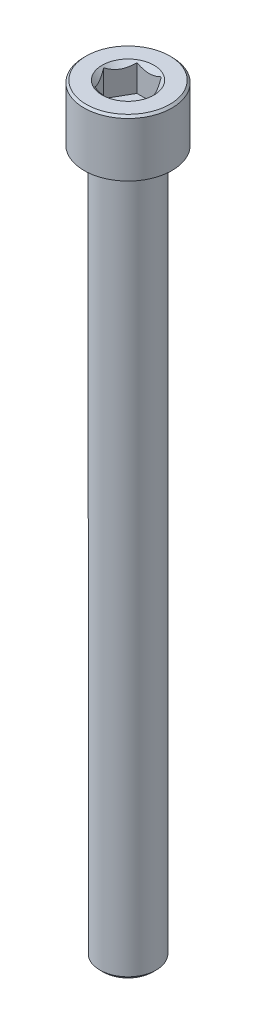
ISO-10303-21;
HEADER;
FILE_DESCRIPTION(('STEP AP214'),'2;1');
FILE_NAME('part.step','',(''),(''),'','','');
FILE_SCHEMA(('AUTOMOTIVE_DESIGN { 1 0 10303 214 1 1 1 1 }'));
ENDSEC;
DATA;
#1=APPLICATION_CONTEXT('core data for automotive mechanical design processes');
#2=APPLICATION_PROTOCOL_DEFINITION('international standard','automotive_design',2000,#1);
#3=PRODUCT_CONTEXT('',#1,'mechanical');
#4=PRODUCT('Part','Part','',(#3));
#5=PRODUCT_RELATED_PRODUCT_CATEGORY('part','',(#4));
#6=PRODUCT_DEFINITION_FORMATION('','',#4);
#7=PRODUCT_DEFINITION_CONTEXT('part definition',#1,'design');
#8=PRODUCT_DEFINITION('design','',#6,#7);
#9=PRODUCT_DEFINITION_SHAPE('','',#8);
#10=(LENGTH_UNIT() NAMED_UNIT(*) SI_UNIT(.MILLI.,.METRE.));
#11=(NAMED_UNIT(*) PLANE_ANGLE_UNIT() SI_UNIT($,.RADIAN.));
#12=(NAMED_UNIT(*) SI_UNIT($,.STERADIAN.) SOLID_ANGLE_UNIT());
#13=UNCERTAINTY_MEASURE_WITH_UNIT(LENGTH_MEASURE(1.E-05),#10,'distance_accuracy_value','');
#14=(GEOMETRIC_REPRESENTATION_CONTEXT(3) GLOBAL_UNCERTAINTY_ASSIGNED_CONTEXT((#13)) GLOBAL_UNIT_ASSIGNED_CONTEXT((#10,
#11,#12)) REPRESENTATION_CONTEXT('',''));
#15=CARTESIAN_POINT('',(0.,0.,0.));
#16=DIRECTION('',(0.,0.,1.));
#17=DIRECTION('',(1.,0.,0.));
#18=AXIS2_PLACEMENT_3D('',#15,#16,#17);
#19=CARTESIAN_POINT('',(0.,0.,0.));
#20=DIRECTION('',(0.,1.,0.));
#21=DIRECTION('',(0.,0.,1.));
#22=AXIS2_PLACEMENT_3D('',#19,#20,#21);
#23=PLANE('',#22);
#24=CARTESIAN_POINT('',(0.,0.,0.));
#25=DIRECTION('',(0.,1.,0.));
#26=DIRECTION('',(0.,0.,1.));
#27=AXIS2_PLACEMENT_3D('',#24,#25,#26);
#28=CIRCLE('',#27,3.50000000000002);
#29=CARTESIAN_POINT('',(0.,0.,3.50000000000002));
#30=VERTEX_POINT('',#29);
#31=EDGE_CURVE('E42',#30,#30,#28,.F.);
#32=ORIENTED_EDGE('',*,*,#31,.T.);
#33=EDGE_LOOP('',(#32));
#34=FACE_BOUND('',#33,.T.);
#35=ADVANCED_FACE('F34',(#34),#23,.F.);
#36=CARTESIAN_POINT('',(0.,0.,0.));
#37=DIRECTION('',(0.,-1.,0.));
#38=DIRECTION('',(0.,0.,-1.));
#39=AXIS2_PLACEMENT_3D('',#36,#37,#38);
#40=CYLINDRICAL_SURFACE('',#39,4.);
#41=CARTESIAN_POINT('',(0.,0.499999999999997,0.));
#42=DIRECTION('',(0.,1.,0.));
#43=DIRECTION('',(0.,0.,1.));
#44=AXIS2_PLACEMENT_3D('',#41,#42,#43);
#45=CIRCLE('',#44,4.);
#46=CARTESIAN_POINT('',(0.,0.499999999999997,4.));
#47=VERTEX_POINT('',#46);
#48=EDGE_CURVE('E11',#47,#47,#45,.T.);
#49=ORIENTED_EDGE('',*,*,#48,.T.);
#50=EDGE_LOOP('',(#49));
#51=FACE_BOUND('',#50,.T.);
#52=CARTESIAN_POINT('',(0.,100.,0.));
#53=DIRECTION('',(0.,-1.,0.));
#54=DIRECTION('',(0.,0.,-1.));
#55=AXIS2_PLACEMENT_3D('',#52,#53,#54);
#56=CIRCLE('',#55,4.);
#57=CARTESIAN_POINT('',(0.,100.,-4.));
#58=VERTEX_POINT('',#57);
#59=EDGE_CURVE('E119',#58,#58,#56,.T.);
#60=ORIENTED_EDGE('',*,*,#59,.T.);
#61=EDGE_LOOP('',(#60));
#62=FACE_BOUND('',#61,.T.);
#63=ADVANCED_FACE('F190',(#51,#62),#40,.T.);
#64=CARTESIAN_POINT('',(-4.,100.,0.));
#65=DIRECTION('',(0.,1.,0.));
#66=DIRECTION('',(0.,0.,1.));
#67=AXIS2_PLACEMENT_3D('',#64,#65,#66);
#68=PLANE('',#67);
#69=ORIENTED_EDGE('',*,*,#59,.F.);
#70=EDGE_LOOP('',(#69));
#71=FACE_BOUND('',#70,.T.);
#72=CARTESIAN_POINT('',(0.,100.,0.));
#73=DIRECTION('',(0.,-1.,0.));
#74=DIRECTION('',(0.,0.,-1.));
#75=AXIS2_PLACEMENT_3D('',#72,#73,#74);
#76=CIRCLE('',#75,6.25);
#77=CARTESIAN_POINT('',(0.,100.,-6.25));
#78=VERTEX_POINT('',#77);
#79=EDGE_CURVE('E116',#78,#78,#76,.T.);
#80=ORIENTED_EDGE('',*,*,#79,.T.);
#81=EDGE_LOOP('',(#80));
#82=FACE_BOUND('',#81,.T.);
#83=ADVANCED_FACE('F196',(#71,#82),#68,.F.);
#84=CARTESIAN_POINT('',(0.,0.,0.));
#85=DIRECTION('',(0.,-1.,0.));
#86=DIRECTION('',(0.,0.,-1.));
#87=AXIS2_PLACEMENT_3D('',#84,#85,#86);
#88=CYLINDRICAL_SURFACE('',#87,6.25);
#89=CARTESIAN_POINT('',(0.,107.7,0.));
#90=DIRECTION('',(0.,-1.,0.));
#91=DIRECTION('',(0.,0.,-1.));
#92=AXIS2_PLACEMENT_3D('',#89,#90,#91);
#93=CIRCLE('',#92,6.25);
#94=CARTESIAN_POINT('',(0.,107.7,-6.25));
#95=VERTEX_POINT('',#94);
#96=EDGE_CURVE('E122',#95,#95,#93,.T.);
#97=ORIENTED_EDGE('',*,*,#96,.T.);
#98=EDGE_LOOP('',(#97));
#99=FACE_BOUND('',#98,.T.);
#100=ORIENTED_EDGE('',*,*,#79,.F.);
#101=EDGE_LOOP('',(#100));
#102=FACE_BOUND('',#101,.T.);
#103=ADVANCED_FACE('F207',(#99,#102),#88,.T.);
#104=CARTESIAN_POINT('',(-6.25,108.,0.));
#105=DIRECTION('',(0.,-1.,0.));
#106=DIRECTION('',(0.,0.,-1.));
#107=AXIS2_PLACEMENT_3D('',#104,#105,#106);
#108=PLANE('',#107);
#109=CARTESIAN_POINT('',(0.,108.,0.));
#110=DIRECTION('',(0.,1.,0.));
#111=DIRECTION('',(0.,0.,1.));
#112=AXIS2_PLACEMENT_3D('',#109,#110,#111);
#113=CIRCLE('',#112,3.68172134015619);
#114=CARTESIAN_POINT('',(0.,108.,3.68172134015619));
#115=VERTEX_POINT('',#114);
#116=EDGE_CURVE('E337',#115,#115,#113,.T.);
#117=ORIENTED_EDGE('',*,*,#116,.F.);
#118=EDGE_LOOP('',(#117));
#119=FACE_BOUND('',#118,.T.);
#120=CARTESIAN_POINT('',(0.,108.,0.));
#121=DIRECTION('',(0.,-1.,0.));
#122=DIRECTION('',(0.,0.,-1.));
#123=AXIS2_PLACEMENT_3D('',#120,#121,#122);
#124=CIRCLE('',#123,5.95);
#125=CARTESIAN_POINT('',(0.,108.,-5.95));
#126=VERTEX_POINT('',#125);
#127=EDGE_CURVE('E93',#126,#126,#124,.F.);
#128=ORIENTED_EDGE('',*,*,#127,.T.);
#129=EDGE_LOOP('',(#128));
#130=FACE_BOUND('',#129,.T.);
#131=ADVANCED_FACE('F202',(#119,#130),#108,.F.);
#132=CARTESIAN_POINT('',(0.,107.7,0.));
#133=DIRECTION('',(0.,-1.,0.));
#134=DIRECTION('',(0.,0.,-1.));
#135=AXIS2_PLACEMENT_3D('',#132,#133,#134);
#136=CONICAL_SURFACE('',#135,6.25,0.78539816339744);
#137=ORIENTED_EDGE('',*,*,#127,.F.);
#138=EDGE_LOOP('',(#137));
#139=FACE_BOUND('',#138,.T.);
#140=ORIENTED_EDGE('',*,*,#96,.F.);
#141=EDGE_LOOP('',(#140));
#142=FACE_BOUND('',#141,.T.);
#143=ADVANCED_FACE('F138',(#139,#142),#136,.T.);
#144=CARTESIAN_POINT('',(0.,108.,0.));
#145=DIRECTION('',(0.,1.,0.));
#146=DIRECTION('',(0.,0.,1.));
#147=AXIS2_PLACEMENT_3D('',#144,#145,#146);
#148=CONICAL_SURFACE('',#147,3.68172134015619,0.785398163397449);
#149=ORIENTED_EDGE('',*,*,#116,.T.);
#150=EDGE_LOOP('',(#149));
#151=FACE_BOUND('',#150,.T.);
#152=CARTESIAN_POINT('',(-3.57414153717217,108.984592807835,3.));
#153=CARTESIAN_POINT('',(-3.48763354421077,108.918347344031,3.));
#154=CARTESIAN_POINT('',(-3.40065485701271,108.852706801405,3.));
#155=CARTESIAN_POINT('',(-3.22556536628367,108.722910559625,3.));
#156=CARTESIAN_POINT('',(-3.13745429592208,108.658755220799,3.));
#157=CARTESIAN_POINT('',(-2.95926502940819,108.531747762569,3.));
#158=CARTESIAN_POINT('',(-2.86917689491204,108.468909540486,3.));
#159=CARTESIAN_POINT('',(-2.68749351951163,108.345458372127,3.));
#160=CARTESIAN_POINT('',(-2.5958983836401,108.284845271712,3.));
#161=CARTESIAN_POINT('',(-2.40523426187287,108.162685615211,3.));
#162=CARTESIAN_POINT('',(-2.30605328102177,108.101312978607,3.));
#163=CARTESIAN_POINT('',(-2.105365061048,107.982432521032,3.));
#164=CARTESIAN_POINT('',(-2.00385743987677,107.924925340978,3.));
#165=CARTESIAN_POINT('',(-1.79849745550954,107.815004606373,3.));
#166=CARTESIAN_POINT('',(-1.69465316441121,107.762576089066,3.));
#167=CARTESIAN_POINT('',(-1.48405420683512,107.663987161909,3.));
#168=CARTESIAN_POINT('',(-1.37730092797841,107.617823824235,3.));
#169=CARTESIAN_POINT('',(-1.17088222190216,107.53741031137,3.));
#170=CARTESIAN_POINT('',(-1.07149734601239,107.502447322176,3.));
#171=CARTESIAN_POINT('',(-0.870230144552076,107.440480240414,3.));
#172=CARTESIAN_POINT('',(-0.768347657354247,107.4134766644,3.));
#173=CARTESIAN_POINT('',(-0.564447624779061,107.36932660234,3.));
#174=CARTESIAN_POINT('',(-0.462468933304163,107.352003667627,3.));
#175=CARTESIAN_POINT('',(-0.257288650084501,107.327570363368,3.));
#176=CARTESIAN_POINT('',(-0.154087304614485,107.320457971263,3.));
#177=CARTESIAN_POINT('',(0.0481861337271449,107.31703234318,3.));
#178=CARTESIAN_POINT('',(0.147250905244539,107.320281023826,3.));
#179=CARTESIAN_POINT('',(0.344589076655326,107.336401424681,3.));
#180=CARTESIAN_POINT('',(0.44286240247697,107.349274035257,3.));
#181=CARTESIAN_POINT('',(0.639570667541517,107.384139691062,3.));
#182=CARTESIAN_POINT('',(0.737976852204942,107.406292278974,3.));
#183=CARTESIAN_POINT('',(0.932628435913937,107.458500908432,3.));
#184=CARTESIAN_POINT('',(1.02887397223985,107.4885564463,3.));
#185=CARTESIAN_POINT('',(1.22532003458177,107.557474722556,3.));
#186=CARTESIAN_POINT('',(1.32536043310458,107.596788867538,3.));
#187=CARTESIAN_POINT('',(1.5228495241282,107.681477566289,3.));
#188=CARTESIAN_POINT('',(1.62029736425405,107.726854084409,3.));
#189=CARTESIAN_POINT('',(1.81308604298931,107.82259854372,3.));
#190=CARTESIAN_POINT('',(1.90841896877327,107.872982289026,3.));
#191=CARTESIAN_POINT('',(2.09689622819787,107.977627277898,3.));
#192=CARTESIAN_POINT('',(2.19004094502824,108.031887835746,3.));
#193=CARTESIAN_POINT('',(2.369872611791,108.140769155629,3.));
#194=CARTESIAN_POINT('',(2.45665114613526,108.195239452964,3.));
#195=CARTESIAN_POINT('',(2.62871750489488,108.306492646486,3.));
#196=CARTESIAN_POINT('',(2.71400521657293,108.363275716495,3.));
#197=CARTESIAN_POINT('',(2.88259790064296,108.47827802722,3.));
#198=CARTESIAN_POINT('',(2.96591330750259,108.536482026023,3.));
#199=CARTESIAN_POINT('',(3.13140205426232,108.654445790406,3.));
#200=CARTESIAN_POINT('',(3.21357570254097,108.714205122864,3.));
#201=CARTESIAN_POINT('',(3.2952705817368,108.77460093352,3.));
#202=B_SPLINE_CURVE_WITH_KNOTS('',3,(#152,#153,#154,#155,#156,#157,#158,#159,#160,#161,#162,
#163,#164,#165,#166,#167,#168,#169,#170,#171,#172,#173,#174,#175,#176,#177,#178,#179,#180,#181,
#182,#183,#184,#185,#186,#187,#188,#189,#190,#191,#192,#193,#194,#195,#196,#197,#198,#199,#200,
#201),.UNSPECIFIED.,.F.,.F.,(4,2,2,2,2,2,2,2,2,2,2,2,2,2,2,2,2,2,2,2,2,2,2,2,4),(0.,
0.326883534696343,0.653845561216819,0.983333574679485,1.31279872045119,1.66263039077582,
2.012519923068,2.36134508374108,2.71000666706381,3.02579926641578,3.34161235580212,
3.65146388205708,3.96125402275307,4.25812208285705,4.55501761141501,4.85724167639796,
5.15944648441816,5.48166266665303,5.80398350895796,6.12735610013868,6.45067163510515,
6.7580009601291,7.0653534259893,7.37023156667128,7.67502569597),.UNSPECIFIED.);
#203=CARTESIAN_POINT('',(-1.73205080756888,107.782380274982,3.));
#204=VERTEX_POINT('',#203);
#205=CARTESIAN_POINT('',(1.73205080756888,107.782380274982,3.));
#206=VERTEX_POINT('',#205);
#207=EDGE_CURVE('E100',#204,#206,#202,.T.);
#208=ORIENTED_EDGE('',*,*,#207,.F.);
#209=CARTESIAN_POINT('',(-3.46421708519159,107.782495750809,-0.000199999999999535));
#210=CARTESIAN_POINT('',(-3.40467869607211,107.723008593303,0.102923514955744));
#211=CARTESIAN_POINT('',(-3.34414474757781,107.667015254447,0.207771389330644));
#212=CARTESIAN_POINT('',(-3.2207094063533,107.564492871361,0.421567671781089));
#213=CARTESIAN_POINT('',(-3.15779627521276,107.518020868723,0.530536411379754));
#214=CARTESIAN_POINT('',(-3.03093496880242,107.438413463498,0.750266639597022));
#215=CARTESIAN_POINT('',(-2.96701910000607,107.405077975624,0.860972171762204));
#216=CARTESIAN_POINT('',(-2.83778025907547,107.353717818961,1.08482041056532));
#217=CARTESIAN_POINT('',(-2.7724612348602,107.335654812517,1.19795627920698));
#218=CARTESIAN_POINT('',(-2.65988677911465,107.319357183432,1.39294095619269));
#219=CARTESIAN_POINT('',(-2.61277673046431,107.316944642155,1.47453795400212));
#220=CARTESIAN_POINT('',(-2.51863325954798,107.321009709639,1.63759922883008));
#221=CARTESIAN_POINT('',(-2.47159986993094,107.32749043501,1.71906344929898));
#222=CARTESIAN_POINT('',(-2.37797867687426,107.348971997497,1.88122011233836));
#223=CARTESIAN_POINT('',(-2.3313914312269,107.363982364949,1.96191158878429));
#224=CARTESIAN_POINT('',(-2.23901705721439,107.401703921048,2.12190869789132));
#225=CARTESIAN_POINT('',(-2.1932298677905,107.424414519304,2.20121443630928));
#226=CARTESIAN_POINT('',(-2.11194373930154,107.471140959836,2.34200614080274));
#227=CARTESIAN_POINT('',(-2.07626488907773,107.493928602662,2.40380372214601));
#228=CARTESIAN_POINT('',(-2.00554773988156,107.543176561039,2.52628941752021));
#229=CARTESIAN_POINT('',(-1.97050946049034,107.569636988648,2.58697749763559));
#230=CARTESIAN_POINT('',(-1.90118383838356,107.625637269373,2.70705299739086));
#231=CARTESIAN_POINT('',(-1.86689452386373,107.65516743946,2.76644383229591));
#232=CARTESIAN_POINT('',(-1.79895094584795,107.716919366557,2.88412556146727));
#233=CARTESIAN_POINT('',(-1.76529630793217,107.749139471641,2.94241710424773));
#234=CARTESIAN_POINT('',(-1.73193533751504,107.782495750809,3.0002));
#235=B_SPLINE_CURVE_WITH_KNOTS('',3,(#209,#210,#211,#212,#213,#214,#215,#216,#217,#218,#219,
#220,#221,#222,#223,#224,#225,#226,#227,#228,#229,#230,#231,#232,#233,#234),.UNSPECIFIED.,.F.,
.F.,(4,2,2,2,2,2,2,2,2,2,2,2,4),(0.,0.399603557139297,0.801535286397833,1.19708369162342,
1.59163620080172,1.87398941755843,2.15644160919091,2.43921001247424,2.72195674032136,
2.94657516661925,3.17120044767274,3.39513752837809,3.61893808380739),.UNSPECIFIED.);
#236=CARTESIAN_POINT('',(-3.46410161513775,107.782380274982,0.));
#237=VERTEX_POINT('',#236);
#238=EDGE_CURVE('E158',#237,#204,#235,.T.);
#239=ORIENTED_EDGE('',*,*,#238,.F.);
#240=CARTESIAN_POINT('',(-1.73193533751504,107.782495750809,-3.0002));
#241=CARTESIAN_POINT('',(-1.79147372663452,107.723008593303,-2.89707648504425));
#242=CARTESIAN_POINT('',(-1.85200767512883,107.667015254447,-2.79222861066935));
#243=CARTESIAN_POINT('',(-1.97544301635334,107.564492871361,-2.5784323282189));
#244=CARTESIAN_POINT('',(-2.03835614749388,107.518020868723,-2.46946358862024));
#245=CARTESIAN_POINT('',(-2.16521745390422,107.438413463498,-2.24973336040297));
#246=CARTESIAN_POINT('',(-2.22913332270057,107.405077975624,-2.13902782823779));
#247=CARTESIAN_POINT('',(-2.35837216363117,107.353717818961,-1.91517958943468));
#248=CARTESIAN_POINT('',(-2.42369118784644,107.335654812517,-1.80204372079301));
#249=CARTESIAN_POINT('',(-2.53626564359199,107.319357183432,-1.6070590438073));
#250=CARTESIAN_POINT('',(-2.58337569224233,107.316944642155,-1.52546204599787));
#251=CARTESIAN_POINT('',(-2.67751916315865,107.321009709639,-1.36240077116991));
#252=CARTESIAN_POINT('',(-2.72455255277569,107.32749043501,-1.28093655070102));
#253=CARTESIAN_POINT('',(-2.81817374583237,107.348971997497,-1.11877988766163));
#254=CARTESIAN_POINT('',(-2.86476099147974,107.363982364949,-1.0380884112157));
#255=CARTESIAN_POINT('',(-2.95713536549225,107.401703921048,-0.87809130210867));
#256=CARTESIAN_POINT('',(-3.00292255491614,107.424414519304,-0.798785563690709));
#257=CARTESIAN_POINT('',(-3.0842086834051,107.471140959836,-0.657993859197251));
#258=CARTESIAN_POINT('',(-3.11988753362891,107.493928602662,-0.596196277853977));
#259=CARTESIAN_POINT('',(-3.19060468282508,107.543176561039,-0.473710582479782));
#260=CARTESIAN_POINT('',(-3.2256429622163,107.569636988648,-0.413022502364399));
#261=CARTESIAN_POINT('',(-3.29496858432307,107.625637269373,-0.29294700260914));
#262=CARTESIAN_POINT('',(-3.32925789884291,107.65516743946,-0.233556167704084));
#263=CARTESIAN_POINT('',(-3.39720147685869,107.716919366557,-0.115874438532732));
#264=CARTESIAN_POINT('',(-3.43085611477447,107.749139471641,-0.0575828957522648));
#265=CARTESIAN_POINT('',(-3.46421708519159,107.782495750809,0.000199999999999888));
#266=B_SPLINE_CURVE_WITH_KNOTS('',3,(#240,#241,#242,#243,#244,#245,#246,#247,#248,#249,#250,
#251,#252,#253,#254,#255,#256,#257,#258,#259,#260,#261,#262,#263,#264,#265),.UNSPECIFIED.,.F.,
.F.,(4,2,2,2,2,2,2,2,2,2,2,2,4),(0.,0.399603557139306,0.801535286397845,1.19708369162343,
1.59163620080172,1.87398941755844,2.15644160919092,2.43921001247424,2.72195674032137,
2.94657516661926,3.17120044767274,3.39513752837809,3.61893808380739),.UNSPECIFIED.);
#267=CARTESIAN_POINT('',(-1.73205080756888,107.782380274982,-3.));
#268=VERTEX_POINT('',#267);
#269=EDGE_CURVE('E152',#268,#237,#266,.T.);
#270=ORIENTED_EDGE('',*,*,#269,.F.);
#271=CARTESIAN_POINT('',(-3.57414153716177,108.984592807827,-3.));
#272=CARTESIAN_POINT('',(-3.48763354420066,108.918347344023,-3.));
#273=CARTESIAN_POINT('',(-3.4006548570029,108.852706801397,-3.));
#274=CARTESIAN_POINT('',(-3.22556536627446,108.722910559618,-3.));
#275=CARTESIAN_POINT('',(-3.13745429591317,108.658755220793,-3.));
#276=CARTESIAN_POINT('',(-2.95926502939989,108.531747762563,-3.));
#277=CARTESIAN_POINT('',(-2.86917689490405,108.46890954048,-3.));
#278=CARTESIAN_POINT('',(-2.68749351950427,108.345458372122,-3.));
#279=CARTESIAN_POINT('',(-2.59589838363306,108.284845271707,-3.));
#280=CARTESIAN_POINT('',(-2.40523426186653,108.162685615207,-3.));
#281=CARTESIAN_POINT('',(-2.3060532810158,108.101312978603,-3.));
#282=CARTESIAN_POINT('',(-2.10536506104279,107.982432521029,-3.));
#283=CARTESIAN_POINT('',(-2.00385743987194,107.924925340976,-3.));
#284=CARTESIAN_POINT('',(-1.79849745550547,107.815004606371,-3.));
#285=CARTESIAN_POINT('',(-1.69465316440754,107.762576089064,-3.));
#286=CARTESIAN_POINT('',(-1.48405420683225,107.663987161908,-3.));
#287=CARTESIAN_POINT('',(-1.37730092797596,107.617823824234,-3.));
#288=CARTESIAN_POINT('',(-1.17088222189989,107.537410311369,-3.));
#289=CARTESIAN_POINT('',(-1.07149734600986,107.502447322176,-3.));
#290=CARTESIAN_POINT('',(-0.870230144549019,107.440480240413,-3.));
#291=CARTESIAN_POINT('',(-0.768347657350922,107.413476664399,-3.));
#292=CARTESIAN_POINT('',(-0.564447624775211,107.36932660234,-3.));
#293=CARTESIAN_POINT('',(-0.462468933300055,107.352003667626,-3.));
#294=CARTESIAN_POINT('',(-0.257288650079884,107.327570363368,-3.));
#295=CARTESIAN_POINT('',(-0.154087304609616,107.320457971262,-3.));
#296=CARTESIAN_POINT('',(0.0481861337324526,107.317032343181,-3.));
#297=CARTESIAN_POINT('',(0.147250905250035,107.320281023826,-3.));
#298=CARTESIAN_POINT('',(0.344589076661178,107.336401424681,-3.));
#299=CARTESIAN_POINT('',(0.442862402482988,107.349274035258,-3.));
#300=CARTESIAN_POINT('',(0.639570667547867,107.384139691064,-3.));
#301=CARTESIAN_POINT('',(0.737976852211455,107.406292278976,-3.));
#302=CARTESIAN_POINT('',(0.932628435920758,107.458500908434,-3.));
#303=CARTESIAN_POINT('',(1.02887397224682,107.488556446302,-3.));
#304=CARTESIAN_POINT('',(1.22532003458955,107.557474722558,-3.));
#305=CARTESIAN_POINT('',(1.32536043311302,107.596788867542,-3.));
#306=CARTESIAN_POINT('',(1.52284952413792,107.681477566293,-3.));
#307=CARTESIAN_POINT('',(1.62029736426438,107.726854084414,-3.));
#308=CARTESIAN_POINT('',(1.81308604300086,107.822598543726,-3.));
#309=CARTESIAN_POINT('',(1.90841896878542,107.872982289032,-3.));
#310=CARTESIAN_POINT('',(2.0968962282112,107.977627277905,-3.));
#311=CARTESIAN_POINT('',(2.19004094504215,108.031887835754,-3.));
#312=CARTESIAN_POINT('',(2.36987261180595,108.140769155638,-3.));
#313=CARTESIAN_POINT('',(2.45665114615069,108.195239452973,-3.));
#314=CARTESIAN_POINT('',(2.62871750491126,108.306492646496,-3.));
#315=CARTESIAN_POINT('',(2.71400521658978,108.363275716506,-3.));
#316=CARTESIAN_POINT('',(2.88259790066073,108.478278027232,-3.));
#317=CARTESIAN_POINT('',(2.96591330752082,108.536482026036,-3.));
#318=CARTESIAN_POINT('',(3.13140205428145,108.65444579042,-3.));
#319=CARTESIAN_POINT('',(3.21357570256055,108.714205122879,-3.));
#320=CARTESIAN_POINT('',(3.29527058175683,108.774600933535,-3.));
#321=B_SPLINE_CURVE_WITH_KNOTS('',3,(#271,#272,#273,#274,#275,#276,#277,#278,#279,#280,#281,
#282,#283,#284,#285,#286,#287,#288,#289,#290,#291,#292,#293,#294,#295,#296,#297,#298,#299,#300,
#301,#302,#303,#304,#305,#306,#307,#308,#309,#310,#311,#312,#313,#314,#315,#316,#317,#318,#319,
#320),.UNSPECIFIED.,.F.,.F.,(4,2,2,2,2,2,2,2,2,2,2,2,2,2,2,2,2,2,2,2,2,2,2,2,4),(0.,
0.326883534695068,0.653845561214274,0.983333574675667,1.31279872044605,1.66263039076921,
2.01251992305992,2.36134508373158,2.71000666705287,3.0257992664056,3.34161235579268,
3.65146388204836,3.96125402274507,4.25812208284963,4.55501761140817,4.85724167639175,
5.15944648441258,5.48166266664978,5.80398350895705,6.12735610014013,6.45067163510897,
6.75800096013493,7.06535342599714,7.3702315666811,7.67502569598179),.UNSPECIFIED.);
#322=CARTESIAN_POINT('',(1.73205080756888,107.782380274982,-3.));
#323=VERTEX_POINT('',#322);
#324=EDGE_CURVE('E49',#323,#268,#321,.F.);
#325=ORIENTED_EDGE('',*,*,#324,.F.);
#326=CARTESIAN_POINT('',(3.46421708519159,107.782495750809,0.000199999999998427));
#327=CARTESIAN_POINT('',(3.40467869607211,107.723008593303,-0.102923514955751));
#328=CARTESIAN_POINT('',(3.3441447475778,107.667015254447,-0.207771389330653));
#329=CARTESIAN_POINT('',(3.22070940635329,107.564492871361,-0.421567671781099));
#330=CARTESIAN_POINT('',(3.15779627521275,107.518020868723,-0.530536411379763));
#331=CARTESIAN_POINT('',(3.03093496880241,107.438413463498,-0.750266639597031));
#332=CARTESIAN_POINT('',(2.96701910000606,107.405077975624,-0.860972171762213));
#333=CARTESIAN_POINT('',(2.83778025907546,107.353717818961,-1.08482041056532));
#334=CARTESIAN_POINT('',(2.7724612348602,107.335654812517,-1.19795627920699));
#335=CARTESIAN_POINT('',(2.65988677911464,107.319357183432,-1.3929409561927));
#336=CARTESIAN_POINT('',(2.6127767304643,107.316944642155,-1.47453795400213));
#337=CARTESIAN_POINT('',(2.51863325954798,107.321009709639,-1.63759922883009));
#338=CARTESIAN_POINT('',(2.47159986993094,107.32749043501,-1.71906344929899));
#339=CARTESIAN_POINT('',(2.37797867687426,107.348971997497,-1.88122011233837));
#340=CARTESIAN_POINT('',(2.33139143122689,107.363982364949,-1.9619115887843));
#341=CARTESIAN_POINT('',(2.23901705721438,107.401703921048,-2.12190869789133));
#342=CARTESIAN_POINT('',(2.19322986779049,107.424414519304,-2.20121443630929));
#343=CARTESIAN_POINT('',(2.11194373930153,107.471140959836,-2.34200614080275));
#344=CARTESIAN_POINT('',(2.07626488907772,107.493928602662,-2.40380372214602));
#345=CARTESIAN_POINT('',(2.00554773988155,107.543176561039,-2.52628941752022));
#346=CARTESIAN_POINT('',(1.97050946049033,107.569636988648,-2.5869774976356));
#347=CARTESIAN_POINT('',(1.90118383838356,107.625637269373,-2.70705299739086));
#348=CARTESIAN_POINT('',(1.86689452386373,107.65516743946,-2.76644383229592));
#349=CARTESIAN_POINT('',(1.79895094584795,107.716919366557,-2.88412556146727));
#350=CARTESIAN_POINT('',(1.76529630793217,107.749139471641,-2.94241710424773));
#351=CARTESIAN_POINT('',(1.73193533751504,107.782495750809,-3.0002));
#352=B_SPLINE_CURVE_WITH_KNOTS('',3,(#326,#327,#328,#329,#330,#331,#332,#333,#334,#335,#336,
#337,#338,#339,#340,#341,#342,#343,#344,#345,#346,#347,#348,#349,#350,#351),.UNSPECIFIED.,.F.,
.F.,(4,2,2,2,2,2,2,2,2,2,2,2,4),(0.,0.399603557139308,0.801535286397849,1.19708369162343,
1.59163620080173,1.87398941755844,2.15644160919092,2.43921001247425,2.72195674032138,
2.94657516661926,3.17120044767274,3.39513752837809,3.61893808380739),.UNSPECIFIED.);
#353=CARTESIAN_POINT('',(3.46410161513775,107.782380274982,0.));
#354=VERTEX_POINT('',#353);
#355=EDGE_CURVE('E86',#354,#323,#352,.T.);
#356=ORIENTED_EDGE('',*,*,#355,.F.);
#357=CARTESIAN_POINT('',(1.73193533751504,107.782495750809,3.0002));
#358=CARTESIAN_POINT('',(1.79147372663452,107.723008593303,2.89707648504426));
#359=CARTESIAN_POINT('',(1.85200767512883,107.667015254447,2.79222861066936));
#360=CARTESIAN_POINT('',(1.97544301635333,107.564492871361,2.57843232821891));
#361=CARTESIAN_POINT('',(2.03835614749388,107.518020868723,2.46946358862025));
#362=CARTESIAN_POINT('',(2.16521745390421,107.438413463498,2.24973336040298));
#363=CARTESIAN_POINT('',(2.22913332270056,107.405077975624,2.1390278282378));
#364=CARTESIAN_POINT('',(2.35837216363116,107.353717818961,1.91517958943468));
#365=CARTESIAN_POINT('',(2.42369118784643,107.335654812517,1.80204372079302));
#366=CARTESIAN_POINT('',(2.53626564359198,107.319357183432,1.60705904380731));
#367=CARTESIAN_POINT('',(2.58337569224232,107.316944642155,1.52546204599788));
#368=CARTESIAN_POINT('',(2.67751916315865,107.321009709639,1.36240077116992));
#369=CARTESIAN_POINT('',(2.72455255277569,107.32749043501,1.28093655070102));
#370=CARTESIAN_POINT('',(2.81817374583237,107.348971997497,1.11877988766164));
#371=CARTESIAN_POINT('',(2.86476099147973,107.363982364949,1.03808841121571));
#372=CARTESIAN_POINT('',(2.95713536549224,107.401703921048,0.878091302108675));
#373=CARTESIAN_POINT('',(3.00292255491613,107.424414519304,0.798785563690714));
#374=CARTESIAN_POINT('',(3.0842086834051,107.471140959836,0.65799385919726));
#375=CARTESIAN_POINT('',(3.1198875336289,107.493928602662,0.596196277853988));
#376=CARTESIAN_POINT('',(3.19060468282507,107.543176561039,0.473710582479792));
#377=CARTESIAN_POINT('',(3.22564296221629,107.569636988648,0.413022502364405));
#378=CARTESIAN_POINT('',(3.29496858432307,107.625637269373,0.292947002609141));
#379=CARTESIAN_POINT('',(3.3292578988429,107.65516743946,0.233556167704086));
#380=CARTESIAN_POINT('',(3.39720147685868,107.716919366557,0.115874438532734));
#381=CARTESIAN_POINT('',(3.43085611477446,107.749139471641,0.0575828957522665));
#382=CARTESIAN_POINT('',(3.46421708519159,107.782495750809,-0.000199999999998981));
#383=B_SPLINE_CURVE_WITH_KNOTS('',3,(#357,#358,#359,#360,#361,#362,#363,#364,#365,#366,#367,
#368,#369,#370,#371,#372,#373,#374,#375,#376,#377,#378,#379,#380,#381,#382),.UNSPECIFIED.,.F.,
.F.,(4,2,2,2,2,2,2,2,2,2,2,2,4),(0.,0.399603557139297,0.801535286397834,1.19708369162342,
1.59163620080172,1.87398941755843,2.15644160919092,2.43921001247424,2.72195674032136,
2.94657516661925,3.17120044767274,3.39513752837809,3.61893808380739),.UNSPECIFIED.);
#384=EDGE_CURVE('E89',#206,#354,#383,.T.);
#385=ORIENTED_EDGE('',*,*,#384,.F.);
#386=EDGE_LOOP('',(#208,#239,#270,#325,#356,#385));
#387=FACE_BOUND('',#386,.T.);
#388=ADVANCED_FACE('F88',(#151,#387),#148,.F.);
#389=CARTESIAN_POINT('',(3.46410161513775,104.,0.));
#390=DIRECTION('',(0.,1.,0.));
#391=DIRECTION('',(0.,0.,1.));
#392=AXIS2_PLACEMENT_3D('',#389,#390,#391);
#393=PLANE('',#392);
#394=DIRECTION('',(0.5,0.,-0.866025403784439));
#395=VECTOR('',#394,1.);
#396=CARTESIAN_POINT('',(1.73205080756888,104.,3.));
#397=LINE('',#396,#395);
#398=CARTESIAN_POINT('',(1.73205080756888,104.,3.));
#399=VERTEX_POINT('',#398);
#400=CARTESIAN_POINT('',(3.46410161513775,104.,0.));
#401=VERTEX_POINT('',#400);
#402=EDGE_CURVE('E99',#399,#401,#397,.T.);
#403=ORIENTED_EDGE('',*,*,#402,.T.);
#404=DIRECTION('',(-0.5,0.,-0.866025403784438));
#405=VECTOR('',#404,1.);
#406=CARTESIAN_POINT('',(3.46410161513775,104.,0.));
#407=LINE('',#406,#405);
#408=CARTESIAN_POINT('',(1.73205080756888,104.,-3.));
#409=VERTEX_POINT('',#408);
#410=EDGE_CURVE('E104',#401,#409,#407,.T.);
#411=ORIENTED_EDGE('',*,*,#410,.T.);
#412=DIRECTION('',(-1.,0.,0.));
#413=VECTOR('',#412,1.);
#414=CARTESIAN_POINT('',(1.73205080756888,104.,-3.));
#415=LINE('',#414,#413);
#416=CARTESIAN_POINT('',(-1.73205080756888,104.,-3.));
#417=VERTEX_POINT('',#416);
#418=EDGE_CURVE('E319',#409,#417,#415,.T.);
#419=ORIENTED_EDGE('',*,*,#418,.T.);
#420=DIRECTION('',(-0.5,0.,0.866025403784439));
#421=VECTOR('',#420,1.);
#422=CARTESIAN_POINT('',(-1.73205080756888,104.,-3.));
#423=LINE('',#422,#421);
#424=CARTESIAN_POINT('',(-3.46410161513776,104.,0.));
#425=VERTEX_POINT('',#424);
#426=EDGE_CURVE('E323',#417,#425,#423,.T.);
#427=ORIENTED_EDGE('',*,*,#426,.T.);
#428=DIRECTION('',(0.5,0.,0.866025403784439));
#429=VECTOR('',#428,1.);
#430=CARTESIAN_POINT('',(-3.46410161513776,104.,0.));
#431=LINE('',#430,#429);
#432=CARTESIAN_POINT('',(-1.73205080756888,104.,3.));
#433=VERTEX_POINT('',#432);
#434=EDGE_CURVE('E112',#425,#433,#431,.T.);
#435=ORIENTED_EDGE('',*,*,#434,.T.);
#436=DIRECTION('',(1.,0.,0.));
#437=VECTOR('',#436,1.);
#438=CARTESIAN_POINT('',(-1.73205080756888,104.,3.));
#439=LINE('',#438,#437);
#440=EDGE_CURVE('E107',#433,#399,#439,.T.);
#441=ORIENTED_EDGE('',*,*,#440,.T.);
#442=EDGE_LOOP('',(#403,#411,#419,#427,#435,#441));
#443=FACE_BOUND('',#442,.T.);
#444=ADVANCED_FACE('F137',(#443),#393,.T.);
#445=CARTESIAN_POINT('',(3.46410161513775,104.,0.));
#446=DIRECTION('',(0.866025403784439,0.,-0.5));
#447=DIRECTION('',(-0.5,0.,-0.866025403784438));
#448=AXIS2_PLACEMENT_3D('',#445,#446,#447);
#449=PLANE('',#448);
#450=DIRECTION('',(0.,1.,0.));
#451=VECTOR('',#450,1.);
#452=CARTESIAN_POINT('',(3.46410161513775,104.,0.));
#453=LINE('',#452,#451);
#454=EDGE_CURVE('E97',#401,#354,#453,.T.);
#455=ORIENTED_EDGE('',*,*,#454,.T.);
#456=ORIENTED_EDGE('',*,*,#355,.T.);
#457=DIRECTION('',(0.,1.,0.));
#458=VECTOR('',#457,1.);
#459=CARTESIAN_POINT('',(1.73205080756888,104.,-3.));
#460=LINE('',#459,#458);
#461=EDGE_CURVE('E106',#409,#323,#460,.T.);
#462=ORIENTED_EDGE('',*,*,#461,.F.);
#463=ORIENTED_EDGE('',*,*,#410,.F.);
#464=EDGE_LOOP('',(#455,#456,#462,#463));
#465=FACE_BOUND('',#464,.T.);
#466=ADVANCED_FACE('F102',(#465),#449,.F.);
#467=CARTESIAN_POINT('',(1.73205080756888,104.,-3.));
#468=DIRECTION('',(0.,0.,-1.));
#469=DIRECTION('',(-1.,0.,0.));
#470=AXIS2_PLACEMENT_3D('',#467,#468,#469);
#471=PLANE('',#470);
#472=ORIENTED_EDGE('',*,*,#461,.T.);
#473=ORIENTED_EDGE('',*,*,#324,.T.);
#474=DIRECTION('',(0.,1.,0.));
#475=VECTOR('',#474,1.);
#476=CARTESIAN_POINT('',(-1.73205080756888,104.,-3.));
#477=LINE('',#476,#475);
#478=EDGE_CURVE('E109',#417,#268,#477,.T.);
#479=ORIENTED_EDGE('',*,*,#478,.F.);
#480=ORIENTED_EDGE('',*,*,#418,.F.);
#481=EDGE_LOOP('',(#472,#473,#479,#480));
#482=FACE_BOUND('',#481,.T.);
#483=ADVANCED_FACE('F181',(#482),#471,.F.);
#484=CARTESIAN_POINT('',(-1.73205080756888,104.,-3.));
#485=DIRECTION('',(-0.866025403784439,0.,-0.5));
#486=DIRECTION('',(-0.5,0.,0.866025403784439));
#487=AXIS2_PLACEMENT_3D('',#484,#485,#486);
#488=PLANE('',#487);
#489=ORIENTED_EDGE('',*,*,#478,.T.);
#490=ORIENTED_EDGE('',*,*,#269,.T.);
#491=DIRECTION('',(0.,1.,0.));
#492=VECTOR('',#491,1.);
#493=CARTESIAN_POINT('',(-3.46410161513776,104.,0.));
#494=LINE('',#493,#492);
#495=EDGE_CURVE('E331',#425,#237,#494,.T.);
#496=ORIENTED_EDGE('',*,*,#495,.F.);
#497=ORIENTED_EDGE('',*,*,#426,.F.);
#498=EDGE_LOOP('',(#489,#490,#496,#497));
#499=FACE_BOUND('',#498,.T.);
#500=ADVANCED_FACE('F177',(#499),#488,.F.);
#501=CARTESIAN_POINT('',(-3.46410161513776,104.,0.));
#502=DIRECTION('',(-0.866025403784439,0.,0.5));
#503=DIRECTION('',(0.5,0.,0.866025403784439));
#504=AXIS2_PLACEMENT_3D('',#501,#502,#503);
#505=PLANE('',#504);
#506=ORIENTED_EDGE('',*,*,#495,.T.);
#507=ORIENTED_EDGE('',*,*,#238,.T.);
#508=DIRECTION('',(0.,1.,0.));
#509=VECTOR('',#508,1.);
#510=CARTESIAN_POINT('',(-1.73205080756888,104.,3.));
#511=LINE('',#510,#509);
#512=EDGE_CURVE('E328',#433,#204,#511,.T.);
#513=ORIENTED_EDGE('',*,*,#512,.F.);
#514=ORIENTED_EDGE('',*,*,#434,.F.);
#515=EDGE_LOOP('',(#506,#507,#513,#514));
#516=FACE_BOUND('',#515,.T.);
#517=ADVANCED_FACE('F174',(#516),#505,.F.);
#518=CARTESIAN_POINT('',(-1.73205080756888,104.,3.));
#519=DIRECTION('',(0.,0.,1.));
#520=DIRECTION('',(1.,0.,0.));
#521=AXIS2_PLACEMENT_3D('',#518,#519,#520);
#522=PLANE('',#521);
#523=ORIENTED_EDGE('',*,*,#512,.T.);
#524=ORIENTED_EDGE('',*,*,#207,.T.);
#525=DIRECTION('',(0.,1.,0.));
#526=VECTOR('',#525,1.);
#527=CARTESIAN_POINT('',(1.73205080756888,104.,3.));
#528=LINE('',#527,#526);
#529=EDGE_CURVE('E57',#399,#206,#528,.T.);
#530=ORIENTED_EDGE('',*,*,#529,.F.);
#531=ORIENTED_EDGE('',*,*,#440,.F.);
#532=EDGE_LOOP('',(#523,#524,#530,#531));
#533=FACE_BOUND('',#532,.T.);
#534=ADVANCED_FACE('F171',(#533),#522,.F.);
#535=CARTESIAN_POINT('',(1.73205080756888,104.,3.));
#536=DIRECTION('',(0.866025403784439,0.,0.5));
#537=DIRECTION('',(0.5,0.,-0.866025403784439));
#538=AXIS2_PLACEMENT_3D('',#535,#536,#537);
#539=PLANE('',#538);
#540=ORIENTED_EDGE('',*,*,#529,.T.);
#541=ORIENTED_EDGE('',*,*,#384,.T.);
#542=ORIENTED_EDGE('',*,*,#454,.F.);
#543=ORIENTED_EDGE('',*,*,#402,.F.);
#544=EDGE_LOOP('',(#540,#541,#542,#543));
#545=FACE_BOUND('',#544,.T.);
#546=ADVANCED_FACE('F96',(#545),#539,.F.);
#547=CARTESIAN_POINT('',(0.,0.,0.));
#548=DIRECTION('',(0.,1.,0.));
#549=DIRECTION('',(0.,0.,1.));
#550=AXIS2_PLACEMENT_3D('',#547,#548,#549);
#551=CONICAL_SURFACE('',#550,3.50000000000002,0.785398163397434);
#552=ORIENTED_EDGE('',*,*,#48,.F.);
#553=EDGE_LOOP('',(#552));
#554=FACE_BOUND('',#553,.T.);
#555=ORIENTED_EDGE('',*,*,#31,.F.);
#556=EDGE_LOOP('',(#555));
#557=FACE_BOUND('',#556,.T.);
#558=ADVANCED_FACE('F36',(#554,#557),#551,.T.);
#559=CLOSED_SHELL('',(#35,#63,#83,#103,#131,#143,#388,#444,#466,#483,#500,#517,#534,#546,#558));
#560=MANIFOLD_SOLID_BREP('B2',#559);
#561=ADVANCED_BREP_SHAPE_REPRESENTATION('',(#18,#560),#14);
#562=SHAPE_DEFINITION_REPRESENTATION(#9,#561);
ENDSEC;
END-ISO-10303-21;
